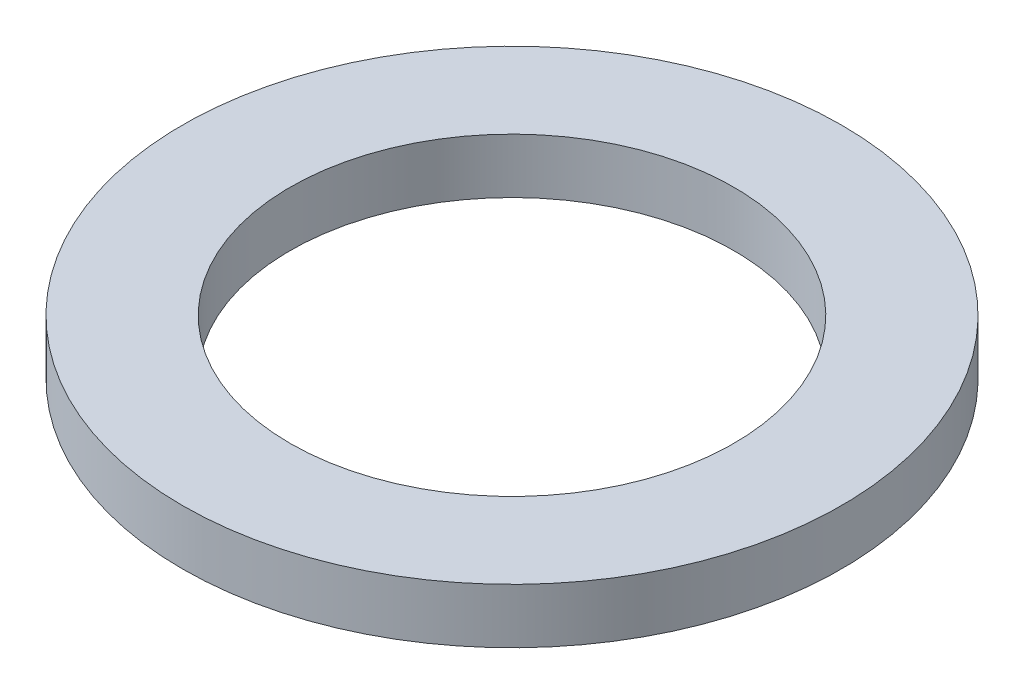
ISO-10303-21;
HEADER;
FILE_DESCRIPTION(('STEP AP214'),'2;1');
FILE_NAME('part.step','',(''),(''),'','','');
FILE_SCHEMA(('AUTOMOTIVE_DESIGN { 1 0 10303 214 1 1 1 1 }'));
ENDSEC;
DATA;
#1=APPLICATION_CONTEXT('core data for automotive mechanical design processes');
#2=APPLICATION_PROTOCOL_DEFINITION('international standard','automotive_design',2000,#1);
#3=PRODUCT_CONTEXT('',#1,'mechanical');
#4=PRODUCT('Part','Part','',(#3));
#5=PRODUCT_RELATED_PRODUCT_CATEGORY('part','',(#4));
#6=PRODUCT_DEFINITION_FORMATION('','',#4);
#7=PRODUCT_DEFINITION_CONTEXT('part definition',#1,'design');
#8=PRODUCT_DEFINITION('design','',#6,#7);
#9=PRODUCT_DEFINITION_SHAPE('','',#8);
#10=(LENGTH_UNIT() NAMED_UNIT(*) SI_UNIT(.MILLI.,.METRE.));
#11=(NAMED_UNIT(*) PLANE_ANGLE_UNIT() SI_UNIT($,.RADIAN.));
#12=(NAMED_UNIT(*) SI_UNIT($,.STERADIAN.) SOLID_ANGLE_UNIT());
#13=UNCERTAINTY_MEASURE_WITH_UNIT(LENGTH_MEASURE(1.E-05),#10,'distance_accuracy_value','');
#14=(GEOMETRIC_REPRESENTATION_CONTEXT(3) GLOBAL_UNCERTAINTY_ASSIGNED_CONTEXT((#13)) GLOBAL_UNIT_ASSIGNED_CONTEXT((#10,
#11,#12)) REPRESENTATION_CONTEXT('',''));
#15=CARTESIAN_POINT('',(0.,0.,0.));
#16=DIRECTION('',(0.,0.,1.));
#17=DIRECTION('',(1.,0.,0.));
#18=AXIS2_PLACEMENT_3D('',#15,#16,#17);
#19=CARTESIAN_POINT('',(0.,1.5875,0.));
#20=DIRECTION('',(0.,1.,0.));
#21=DIRECTION('',(0.,0.,1.));
#22=AXIS2_PLACEMENT_3D('',#19,#20,#21);
#23=PLANE('',#22);
#24=CARTESIAN_POINT('',(0.,1.5875,0.));
#25=DIRECTION('',(0.,1.,0.));
#26=DIRECTION('',(0.,0.,1.));
#27=AXIS2_PLACEMENT_3D('',#24,#25,#26);
#28=CIRCLE('',#27,9.525);
#29=CARTESIAN_POINT('',(0.,1.5875,9.525));
#30=VERTEX_POINT('',#29);
#31=EDGE_CURVE('E10',#30,#30,#28,.T.);
#32=ORIENTED_EDGE('',*,*,#31,.T.);
#33=EDGE_LOOP('',(#32));
#34=FACE_BOUND('',#33,.T.);
#35=CARTESIAN_POINT('',(0.,1.5875,0.));
#36=DIRECTION('',(0.,1.,0.));
#37=DIRECTION('',(0.,0.,1.));
#38=AXIS2_PLACEMENT_3D('',#35,#36,#37);
#39=CIRCLE('',#38,6.4135);
#40=CARTESIAN_POINT('',(0.,1.5875,6.4135));
#41=VERTEX_POINT('',#40);
#42=EDGE_CURVE('E43',#41,#41,#39,.T.);
#43=ORIENTED_EDGE('',*,*,#42,.F.);
#44=EDGE_LOOP('',(#43));
#45=FACE_BOUND('',#44,.T.);
#46=ADVANCED_FACE('F32',(#34,#45),#23,.T.);
#47=CARTESIAN_POINT('',(0.,0.,0.));
#48=DIRECTION('',(0.,1.,0.));
#49=DIRECTION('',(0.,0.,1.));
#50=AXIS2_PLACEMENT_3D('',#47,#48,#49);
#51=PLANE('',#50);
#52=CARTESIAN_POINT('',(0.,0.,0.));
#53=DIRECTION('',(0.,1.,0.));
#54=DIRECTION('',(0.,0.,1.));
#55=AXIS2_PLACEMENT_3D('',#52,#53,#54);
#56=CIRCLE('',#55,9.525);
#57=CARTESIAN_POINT('',(0.,0.,9.525));
#58=VERTEX_POINT('',#57);
#59=EDGE_CURVE('E36',#58,#58,#56,.T.);
#60=ORIENTED_EDGE('',*,*,#59,.F.);
#61=EDGE_LOOP('',(#60));
#62=FACE_BOUND('',#61,.T.);
#63=CARTESIAN_POINT('',(0.,0.,0.));
#64=DIRECTION('',(0.,1.,0.));
#65=DIRECTION('',(0.,0.,1.));
#66=AXIS2_PLACEMENT_3D('',#63,#64,#65);
#67=CIRCLE('',#66,6.4135);
#68=CARTESIAN_POINT('',(0.,0.,6.4135));
#69=VERTEX_POINT('',#68);
#70=EDGE_CURVE('E45',#69,#69,#67,.T.);
#71=ORIENTED_EDGE('',*,*,#70,.T.);
#72=EDGE_LOOP('',(#71));
#73=FACE_BOUND('',#72,.T.);
#74=ADVANCED_FACE('F55',(#62,#73),#51,.F.);
#75=CARTESIAN_POINT('',(0.,1.5875,0.));
#76=DIRECTION('',(0.,-1.,0.));
#77=DIRECTION('',(0.,0.,-1.));
#78=AXIS2_PLACEMENT_3D('',#75,#76,#77);
#79=CYLINDRICAL_SURFACE('',#78,9.525);
#80=ORIENTED_EDGE('',*,*,#31,.F.);
#81=EDGE_LOOP('',(#80));
#82=FACE_BOUND('',#81,.T.);
#83=ORIENTED_EDGE('',*,*,#59,.T.);
#84=EDGE_LOOP('',(#83));
#85=FACE_BOUND('',#84,.T.);
#86=ADVANCED_FACE('F34',(#82,#85),#79,.T.);
#87=CARTESIAN_POINT('',(0.,1.5875,0.));
#88=DIRECTION('',(0.,-1.,0.));
#89=DIRECTION('',(0.,0.,-1.));
#90=AXIS2_PLACEMENT_3D('',#87,#88,#89);
#91=CYLINDRICAL_SURFACE('',#90,6.4135);
#92=ORIENTED_EDGE('',*,*,#42,.T.);
#93=EDGE_LOOP('',(#92));
#94=FACE_BOUND('',#93,.T.);
#95=ORIENTED_EDGE('',*,*,#70,.F.);
#96=EDGE_LOOP('',(#95));
#97=FACE_BOUND('',#96,.T.);
#98=ADVANCED_FACE('F51',(#94,#97),#91,.F.);
#99=CLOSED_SHELL('',(#46,#74,#86,#98));
#100=MANIFOLD_SOLID_BREP('B2',#99);
#101=ADVANCED_BREP_SHAPE_REPRESENTATION('',(#18,#100),#14);
#102=SHAPE_DEFINITION_REPRESENTATION(#9,#101);
ENDSEC;
END-ISO-10303-21;
